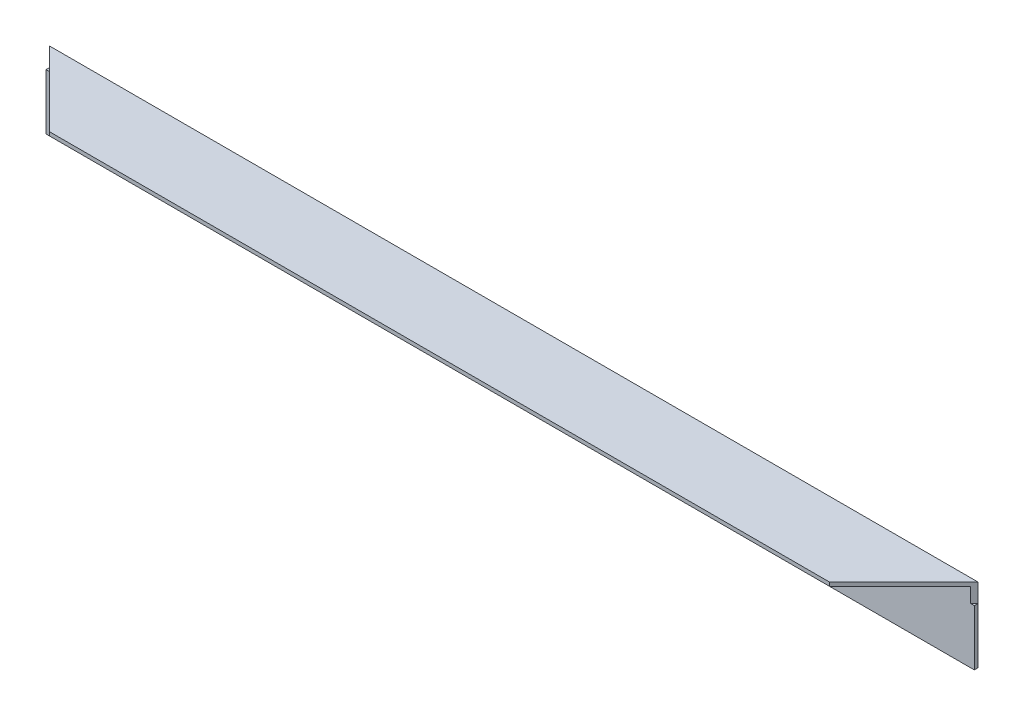
ISO-10303-21;
HEADER;
FILE_DESCRIPTION(('STEP AP214'),'2;1');
FILE_NAME('part.step','',(''),(''),'','','');
FILE_SCHEMA(('AUTOMOTIVE_DESIGN { 1 0 10303 214 1 1 1 1 }'));
ENDSEC;
DATA;
#1=APPLICATION_CONTEXT('core data for automotive mechanical design processes');
#2=APPLICATION_PROTOCOL_DEFINITION('international standard','automotive_design',2000,#1);
#3=PRODUCT_CONTEXT('',#1,'mechanical');
#4=PRODUCT('Part','Part','',(#3));
#5=PRODUCT_RELATED_PRODUCT_CATEGORY('part','',(#4));
#6=PRODUCT_DEFINITION_FORMATION('','',#4);
#7=PRODUCT_DEFINITION_CONTEXT('part definition',#1,'design');
#8=PRODUCT_DEFINITION('design','',#6,#7);
#9=PRODUCT_DEFINITION_SHAPE('','',#8);
#10=(LENGTH_UNIT() NAMED_UNIT(*) SI_UNIT(.MILLI.,.METRE.));
#11=(NAMED_UNIT(*) PLANE_ANGLE_UNIT() SI_UNIT($,.RADIAN.));
#12=(NAMED_UNIT(*) SI_UNIT($,.STERADIAN.) SOLID_ANGLE_UNIT());
#13=UNCERTAINTY_MEASURE_WITH_UNIT(LENGTH_MEASURE(1.E-05),#10,'distance_accuracy_value','');
#14=(GEOMETRIC_REPRESENTATION_CONTEXT(3) GLOBAL_UNCERTAINTY_ASSIGNED_CONTEXT((#13)) GLOBAL_UNIT_ASSIGNED_CONTEXT((#10,
#11,#12)) REPRESENTATION_CONTEXT('',''));
#15=CARTESIAN_POINT('',(0.,0.,0.));
#16=DIRECTION('',(0.,0.,1.));
#17=DIRECTION('',(1.,0.,0.));
#18=AXIS2_PLACEMENT_3D('',#15,#16,#17);
#19=CARTESIAN_POINT('',(-329.545454545455,93.2765151515151,40.));
#20=DIRECTION('',(1.,0.,0.));
#21=DIRECTION('',(0.,0.,-1.));
#22=AXIS2_PLACEMENT_3D('',#19,#20,#21);
#23=PLANE('',#22);
#24=DIRECTION('',(0.,0.,1.));
#25=VECTOR('',#24,1.);
#26=CARTESIAN_POINT('',(-329.545454545455,83.2765151515151,0.));
#27=LINE('',#26,#25);
#28=CARTESIAN_POINT('',(-329.545454545455,83.2765151515151,0.));
#29=VERTEX_POINT('',#28);
#30=CARTESIAN_POINT('',(-329.545454545455,83.2765151515151,2.));
#31=VERTEX_POINT('',#30);
#32=EDGE_CURVE('E104',#29,#31,#27,.T.);
#33=ORIENTED_EDGE('',*,*,#32,.F.);
#34=DIRECTION('',(0.,-1.,0.));
#35=VECTOR('',#34,1.);
#36=CARTESIAN_POINT('',(-329.545454545455,93.2765151515151,0.));
#37=LINE('',#36,#35);
#38=CARTESIAN_POINT('',(-329.545454545455,53.2765151515151,0.));
#39=VERTEX_POINT('',#38);
#40=EDGE_CURVE('E117',#29,#39,#37,.T.);
#41=ORIENTED_EDGE('',*,*,#40,.T.);
#42=DIRECTION('',(0.,0.,-1.));
#43=VECTOR('',#42,1.);
#44=CARTESIAN_POINT('',(-329.545454545455,53.2765151515151,40.));
#45=LINE('',#44,#43);
#46=CARTESIAN_POINT('',(-329.545454545455,53.2765151515151,2.));
#47=VERTEX_POINT('',#46);
#48=EDGE_CURVE('E146',#47,#39,#45,.T.);
#49=ORIENTED_EDGE('',*,*,#48,.F.);
#50=DIRECTION('',(0.,-1.,0.));
#51=VECTOR('',#50,1.);
#52=CARTESIAN_POINT('',(-329.545454545455,91.2765151515151,2.));
#53=LINE('',#52,#51);
#54=EDGE_CURVE('E123',#31,#47,#53,.T.);
#55=ORIENTED_EDGE('',*,*,#54,.F.);
#56=EDGE_LOOP('',(#33,#41,#49,#55));
#57=FACE_BOUND('',#56,.T.);
#58=ADVANCED_FACE('F32',(#57),#23,.F.);
#59=CARTESIAN_POINT('',(170.454545454545,93.2765151515151,40.));
#60=DIRECTION('',(-1.,0.,0.));
#61=DIRECTION('',(0.,-1.,0.));
#62=AXIS2_PLACEMENT_3D('',#59,#60,#61);
#63=PLANE('',#62);
#64=DIRECTION('',(0.,0.,-1.));
#65=VECTOR('',#64,1.);
#66=CARTESIAN_POINT('',(170.454545454545,83.2765151515151,40.));
#67=LINE('',#66,#65);
#68=CARTESIAN_POINT('',(170.454545454545,83.2765151515151,1.99999999999999));
#69=VERTEX_POINT('',#68);
#70=CARTESIAN_POINT('',(170.454545454545,83.2765151515151,0.));
#71=VERTEX_POINT('',#70);
#72=EDGE_CURVE('E156',#69,#71,#67,.T.);
#73=ORIENTED_EDGE('',*,*,#72,.F.);
#74=DIRECTION('',(0.,1.,0.));
#75=VECTOR('',#74,1.);
#76=CARTESIAN_POINT('',(170.454545454545,91.2765151515151,2.));
#77=LINE('',#76,#75);
#78=CARTESIAN_POINT('',(170.454545454545,53.2765151515151,2.));
#79=VERTEX_POINT('',#78);
#80=EDGE_CURVE('E130',#79,#69,#77,.T.);
#81=ORIENTED_EDGE('',*,*,#80,.F.);
#82=DIRECTION('',(0.,0.,-1.));
#83=VECTOR('',#82,1.);
#84=CARTESIAN_POINT('',(170.454545454545,53.2765151515151,40.));
#85=LINE('',#84,#83);
#86=CARTESIAN_POINT('',(170.454545454545,53.2765151515151,0.));
#87=VERTEX_POINT('',#86);
#88=EDGE_CURVE('E144',#79,#87,#85,.T.);
#89=ORIENTED_EDGE('',*,*,#88,.T.);
#90=DIRECTION('',(0.,1.,0.));
#91=VECTOR('',#90,1.);
#92=CARTESIAN_POINT('',(170.454545454545,93.2765151515151,0.));
#93=LINE('',#92,#91);
#94=EDGE_CURVE('E139',#87,#71,#93,.T.);
#95=ORIENTED_EDGE('',*,*,#94,.T.);
#96=EDGE_LOOP('',(#73,#81,#89,#95));
#97=FACE_BOUND('',#96,.T.);
#98=ADVANCED_FACE('F163',(#97),#63,.F.);
#99=CARTESIAN_POINT('',(-329.545454545455,53.2765151515151,40.));
#100=DIRECTION('',(0.,1.,0.));
#101=DIRECTION('',(0.,0.,1.));
#102=AXIS2_PLACEMENT_3D('',#99,#100,#101);
#103=PLANE('',#102);
#104=ORIENTED_EDGE('',*,*,#88,.F.);
#105=DIRECTION('',(-1.,0.,0.));
#106=VECTOR('',#105,1.);
#107=CARTESIAN_POINT('',(224.194660824723,53.2765151515151,2.));
#108=LINE('',#107,#106);
#109=EDGE_CURVE('E170',#79,#47,#108,.T.);
#110=ORIENTED_EDGE('',*,*,#109,.T.);
#111=ORIENTED_EDGE('',*,*,#48,.T.);
#112=DIRECTION('',(1.,0.,0.));
#113=VECTOR('',#112,1.);
#114=CARTESIAN_POINT('',(-329.545454545455,53.2765151515151,0.));
#115=LINE('',#114,#113);
#116=EDGE_CURVE('E116',#39,#87,#115,.T.);
#117=ORIENTED_EDGE('',*,*,#116,.T.);
#118=EDGE_LOOP('',(#104,#110,#111,#117));
#119=FACE_BOUND('',#118,.T.);
#120=ADVANCED_FACE('F214',(#119),#103,.F.);
#121=CARTESIAN_POINT('',(-329.545454545455,93.2765151515151,40.));
#122=DIRECTION('',(0.,-1.,0.));
#123=DIRECTION('',(0.,0.,-1.));
#124=AXIS2_PLACEMENT_3D('',#121,#122,#123);
#125=PLANE('',#124);
#126=DIRECTION('',(-1.,0.,0.));
#127=VECTOR('',#126,1.);
#128=CARTESIAN_POINT('',(-329.545454545455,93.2765151515151,0.));
#129=LINE('',#128,#127);
#130=CARTESIAN_POINT('',(170.454545454545,93.2765151515151,0.));
#131=VERTEX_POINT('',#130);
#132=CARTESIAN_POINT('',(-329.545454545455,93.2765151515151,0.));
#133=VERTEX_POINT('',#132);
#134=EDGE_CURVE('E142',#131,#133,#129,.T.);
#135=ORIENTED_EDGE('',*,*,#134,.T.);
#136=DIRECTION('',(-0.707106781186547,0.,-0.707106781186548));
#137=VECTOR('',#136,1.);
#138=CARTESIAN_POINT('',(-289.545454545455,93.2765151515151,40.));
#139=LINE('',#138,#137);
#140=CARTESIAN_POINT('',(-289.545454545455,93.2765151515151,40.));
#141=VERTEX_POINT('',#140);
#142=EDGE_CURVE('E106',#141,#133,#139,.T.);
#143=ORIENTED_EDGE('',*,*,#142,.F.);
#144=DIRECTION('',(-1.,0.,0.));
#145=VECTOR('',#144,1.);
#146=CARTESIAN_POINT('',(-329.545454545455,93.2765151515151,40.));
#147=LINE('',#146,#145);
#148=CARTESIAN_POINT('',(130.454545454545,93.2765151515151,40.));
#149=VERTEX_POINT('',#148);
#150=EDGE_CURVE('E136',#149,#141,#147,.T.);
#151=ORIENTED_EDGE('',*,*,#150,.F.);
#152=DIRECTION('',(-0.707106781186548,0.,0.707106781186547));
#153=VECTOR('',#152,1.);
#154=CARTESIAN_POINT('',(170.454545454545,93.2765151515151,0.));
#155=LINE('',#154,#153);
#156=EDGE_CURVE('E165',#131,#149,#155,.T.);
#157=ORIENTED_EDGE('',*,*,#156,.F.);
#158=EDGE_LOOP('',(#135,#143,#151,#157));
#159=FACE_BOUND('',#158,.T.);
#160=ADVANCED_FACE('F193',(#159),#125,.F.);
#161=CARTESIAN_POINT('',(0.,0.,40.));
#162=DIRECTION('',(0.,0.,1.));
#163=DIRECTION('',(1.,0.,0.));
#164=AXIS2_PLACEMENT_3D('',#161,#162,#163);
#165=PLANE('',#164);
#166=DIRECTION('',(0.,1.,0.));
#167=VECTOR('',#166,1.);
#168=CARTESIAN_POINT('',(-289.545454545455,83.2765151515151,40.));
#169=LINE('',#168,#167);
#170=CARTESIAN_POINT('',(-289.545454545455,91.2765151515151,40.));
#171=VERTEX_POINT('',#170);
#172=EDGE_CURVE('E124',#171,#141,#169,.T.);
#173=ORIENTED_EDGE('',*,*,#172,.F.);
#174=DIRECTION('',(-1.,0.,0.));
#175=VECTOR('',#174,1.);
#176=CARTESIAN_POINT('',(224.194660824723,91.2765151515151,40.));
#177=LINE('',#176,#175);
#178=CARTESIAN_POINT('',(130.454545454545,91.2765151515151,40.));
#179=VERTEX_POINT('',#178);
#180=EDGE_CURVE('E172',#179,#171,#177,.T.);
#181=ORIENTED_EDGE('',*,*,#180,.F.);
#182=DIRECTION('',(0.,1.,0.));
#183=VECTOR('',#182,1.);
#184=CARTESIAN_POINT('',(130.454545454545,83.2765151515151,40.));
#185=LINE('',#184,#183);
#186=EDGE_CURVE('E54',#179,#149,#185,.T.);
#187=ORIENTED_EDGE('',*,*,#186,.T.);
#188=ORIENTED_EDGE('',*,*,#150,.T.);
#189=EDGE_LOOP('',(#173,#181,#187,#188));
#190=FACE_BOUND('',#189,.T.);
#191=ADVANCED_FACE('F195',(#190),#165,.T.);
#192=CARTESIAN_POINT('',(0.,0.,0.));
#193=DIRECTION('',(0.,0.,1.));
#194=DIRECTION('',(1.,0.,0.));
#195=AXIS2_PLACEMENT_3D('',#192,#193,#194);
#196=PLANE('',#195);
#197=EDGE_CURVE('E109',#133,#29,#37,.T.);
#198=ORIENTED_EDGE('',*,*,#197,.F.);
#199=ORIENTED_EDGE('',*,*,#134,.F.);
#200=DIRECTION('',(0.,1.,0.));
#201=VECTOR('',#200,1.);
#202=CARTESIAN_POINT('',(170.454545454545,83.2765151515151,0.));
#203=LINE('',#202,#201);
#204=EDGE_CURVE('E181',#71,#131,#203,.T.);
#205=ORIENTED_EDGE('',*,*,#204,.F.);
#206=ORIENTED_EDGE('',*,*,#94,.F.);
#207=ORIENTED_EDGE('',*,*,#116,.F.);
#208=ORIENTED_EDGE('',*,*,#40,.F.);
#209=EDGE_LOOP('',(#198,#199,#205,#206,#207,#208));
#210=FACE_BOUND('',#209,.T.);
#211=ADVANCED_FACE('F127',(#210),#196,.F.);
#212=CARTESIAN_POINT('',(224.194660824723,91.2765151515151,2.));
#213=DIRECTION('',(0.,0.,-1.));
#214=DIRECTION('',(0.,1.,0.));
#215=AXIS2_PLACEMENT_3D('',#212,#213,#214);
#216=PLANE('',#215);
#217=DIRECTION('',(-1.,0.,0.));
#218=VECTOR('',#217,1.);
#219=CARTESIAN_POINT('',(224.194660824723,91.2765151515151,2.));
#220=LINE('',#219,#218);
#221=CARTESIAN_POINT('',(168.454545454545,91.2765151515151,1.99999999999999));
#222=VERTEX_POINT('',#221);
#223=CARTESIAN_POINT('',(-327.545454545455,91.2765151515151,2.));
#224=VERTEX_POINT('',#223);
#225=EDGE_CURVE('E132',#222,#224,#220,.T.);
#226=ORIENTED_EDGE('',*,*,#225,.T.);
#227=DIRECTION('',(0.,-1.,0.));
#228=VECTOR('',#227,1.);
#229=CARTESIAN_POINT('',(-327.545454545455,91.2765151515151,2.));
#230=LINE('',#229,#228);
#231=CARTESIAN_POINT('',(-327.545454545455,83.2765151515151,1.99999999999999));
#232=VERTEX_POINT('',#231);
#233=EDGE_CURVE('E46',#224,#232,#230,.T.);
#234=ORIENTED_EDGE('',*,*,#233,.T.);
#235=DIRECTION('',(1.,0.,0.));
#236=VECTOR('',#235,1.);
#237=CARTESIAN_POINT('',(224.194660824723,83.2765151515151,2.));
#238=LINE('',#237,#236);
#239=EDGE_CURVE('E11',#31,#232,#238,.T.);
#240=ORIENTED_EDGE('',*,*,#239,.F.);
#241=ORIENTED_EDGE('',*,*,#54,.T.);
#242=ORIENTED_EDGE('',*,*,#109,.F.);
#243=ORIENTED_EDGE('',*,*,#80,.T.);
#244=DIRECTION('',(1.,0.,0.));
#245=VECTOR('',#244,1.);
#246=CARTESIAN_POINT('',(224.194660824723,83.2765151515151,2.));
#247=LINE('',#246,#245);
#248=CARTESIAN_POINT('',(168.454545454545,83.2765151515151,2.));
#249=VERTEX_POINT('',#248);
#250=EDGE_CURVE('E39',#249,#69,#247,.T.);
#251=ORIENTED_EDGE('',*,*,#250,.F.);
#252=DIRECTION('',(0.,1.,0.));
#253=VECTOR('',#252,1.);
#254=CARTESIAN_POINT('',(168.454545454545,91.2765151515152,2.));
#255=LINE('',#254,#253);
#256=EDGE_CURVE('E179',#249,#222,#255,.T.);
#257=ORIENTED_EDGE('',*,*,#256,.T.);
#258=EDGE_LOOP('',(#226,#234,#240,#241,#242,#243,#251,#257));
#259=FACE_BOUND('',#258,.T.);
#260=ADVANCED_FACE('F168',(#259),#216,.F.);
#261=CARTESIAN_POINT('',(224.194660824723,91.2765151515151,2.));
#262=DIRECTION('',(0.,1.,0.));
#263=DIRECTION('',(0.,0.,1.));
#264=AXIS2_PLACEMENT_3D('',#261,#262,#263);
#265=PLANE('',#264);
#266=ORIENTED_EDGE('',*,*,#180,.T.);
#267=DIRECTION('',(-0.707106781186547,0.,-0.707106781186548));
#268=VECTOR('',#267,1.);
#269=CARTESIAN_POINT('',(-51.6753968603659,91.2765151515151,277.870057685089));
#270=LINE('',#269,#268);
#271=EDGE_CURVE('E150',#171,#224,#270,.T.);
#272=ORIENTED_EDGE('',*,*,#271,.T.);
#273=ORIENTED_EDGE('',*,*,#225,.F.);
#274=DIRECTION('',(-0.707106781186548,0.,0.707106781186547));
#275=VECTOR('',#274,1.);
#276=CARTESIAN_POINT('',(196.324603139634,91.2765151515151,-25.8700576850888));
#277=LINE('',#276,#275);
#278=EDGE_CURVE('E148',#222,#179,#277,.T.);
#279=ORIENTED_EDGE('',*,*,#278,.T.);
#280=EDGE_LOOP('',(#266,#272,#273,#279));
#281=FACE_BOUND('',#280,.T.);
#282=ADVANCED_FACE('F197',(#281),#265,.F.);
#283=CARTESIAN_POINT('',(0.,83.2765151515151,0.));
#284=DIRECTION('',(0.,1.,0.));
#285=DIRECTION('',(0.,0.,1.));
#286=AXIS2_PLACEMENT_3D('',#283,#284,#285);
#287=PLANE('',#286);
#288=ORIENTED_EDGE('',*,*,#250,.T.);
#289=ORIENTED_EDGE('',*,*,#72,.T.);
#290=DIRECTION('',(-0.707106781186548,0.,0.707106781186547));
#291=VECTOR('',#290,1.);
#292=CARTESIAN_POINT('',(170.454545454545,83.2765151515151,0.));
#293=LINE('',#292,#291);
#294=EDGE_CURVE('E158',#71,#249,#293,.T.);
#295=ORIENTED_EDGE('',*,*,#294,.T.);
#296=EDGE_LOOP('',(#288,#289,#295));
#297=FACE_BOUND('',#296,.T.);
#298=ADVANCED_FACE('F155',(#297),#287,.T.);
#299=CARTESIAN_POINT('',(170.454545454545,83.2765151515151,0.));
#300=DIRECTION('',(-0.707106781186547,0.,-0.707106781186548));
#301=DIRECTION('',(-0.707106781186548,0.,0.707106781186547));
#302=AXIS2_PLACEMENT_3D('',#299,#300,#301);
#303=PLANE('',#302);
#304=ORIENTED_EDGE('',*,*,#294,.F.);
#305=ORIENTED_EDGE('',*,*,#204,.T.);
#306=ORIENTED_EDGE('',*,*,#156,.T.);
#307=ORIENTED_EDGE('',*,*,#186,.F.);
#308=ORIENTED_EDGE('',*,*,#278,.F.);
#309=ORIENTED_EDGE('',*,*,#256,.F.);
#310=EDGE_LOOP('',(#304,#305,#306,#307,#308,#309));
#311=FACE_BOUND('',#310,.T.);
#312=ADVANCED_FACE('F199',(#311),#303,.F.);
#313=CARTESIAN_POINT('',(0.,83.2765151515151,0.));
#314=DIRECTION('',(0.,1.,0.));
#315=DIRECTION('',(0.,0.,1.));
#316=AXIS2_PLACEMENT_3D('',#313,#314,#315);
#317=PLANE('',#316);
#318=ORIENTED_EDGE('',*,*,#239,.T.);
#319=DIRECTION('',(-0.707106781186547,0.,-0.707106781186548));
#320=VECTOR('',#319,1.);
#321=CARTESIAN_POINT('',(-289.545454545455,83.2765151515151,40.));
#322=LINE('',#321,#320);
#323=EDGE_CURVE('E100',#232,#29,#322,.T.);
#324=ORIENTED_EDGE('',*,*,#323,.T.);
#325=ORIENTED_EDGE('',*,*,#32,.T.);
#326=EDGE_LOOP('',(#318,#324,#325));
#327=FACE_BOUND('',#326,.T.);
#328=ADVANCED_FACE('F102',(#327),#317,.T.);
#329=CARTESIAN_POINT('',(-289.545454545455,83.2765151515151,40.));
#330=DIRECTION('',(0.707106781186548,0.,-0.707106781186547));
#331=DIRECTION('',(-0.707106781186547,0.,-0.707106781186548));
#332=AXIS2_PLACEMENT_3D('',#329,#330,#331);
#333=PLANE('',#332);
#334=ORIENTED_EDGE('',*,*,#271,.F.);
#335=ORIENTED_EDGE('',*,*,#172,.T.);
#336=ORIENTED_EDGE('',*,*,#142,.T.);
#337=ORIENTED_EDGE('',*,*,#197,.T.);
#338=ORIENTED_EDGE('',*,*,#323,.F.);
#339=ORIENTED_EDGE('',*,*,#233,.F.);
#340=EDGE_LOOP('',(#334,#335,#336,#337,#338,#339));
#341=FACE_BOUND('',#340,.T.);
#342=ADVANCED_FACE('F110',(#341),#333,.F.);
#343=CLOSED_SHELL('',(#58,#98,#120,#160,#191,#211,#260,#282,#298,#312,#328,#342));
#344=MANIFOLD_SOLID_BREP('B2',#343);
#345=ADVANCED_BREP_SHAPE_REPRESENTATION('',(#18,#344),#14);
#346=SHAPE_DEFINITION_REPRESENTATION(#9,#345);
ENDSEC;
END-ISO-10303-21;
